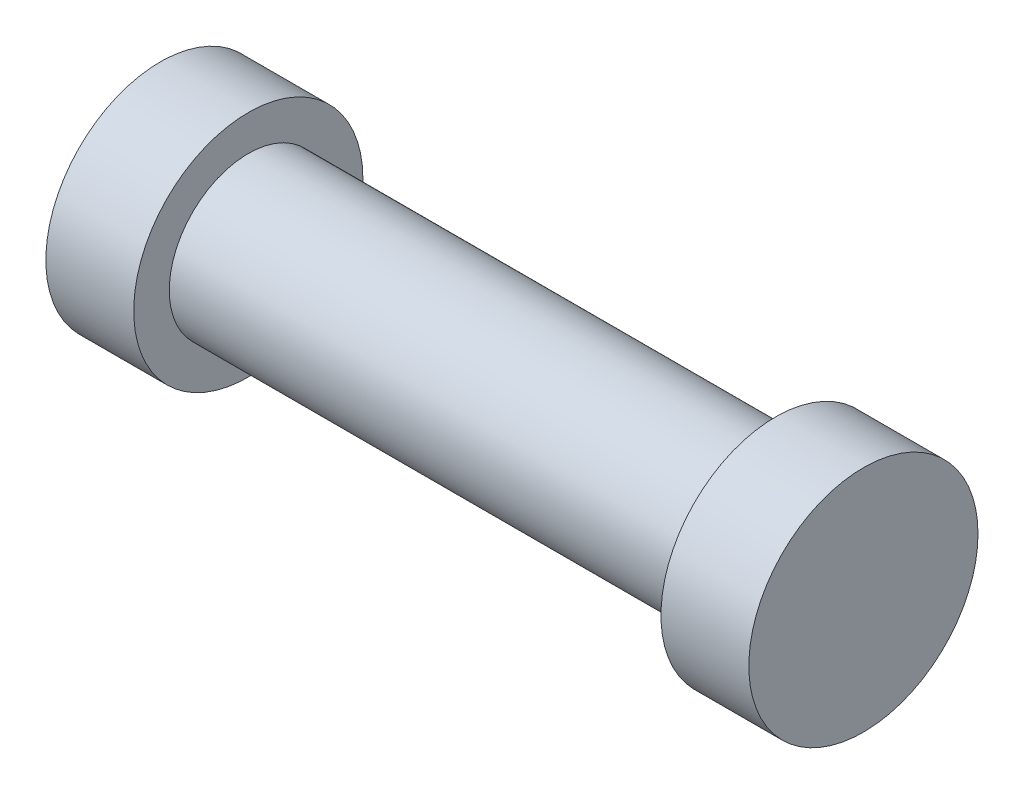
ISO-10303-21;
HEADER;
FILE_DESCRIPTION(('STEP AP214'),'2;1');
FILE_NAME('part.step','',(''),(''),'','','');
FILE_SCHEMA(('AUTOMOTIVE_DESIGN { 1 0 10303 214 1 1 1 1 }'));
ENDSEC;
DATA;
#1=APPLICATION_CONTEXT('core data for automotive mechanical design processes');
#2=APPLICATION_PROTOCOL_DEFINITION('international standard','automotive_design',2000,#1);
#3=PRODUCT_CONTEXT('',#1,'mechanical');
#4=PRODUCT('Part','Part','',(#3));
#5=PRODUCT_RELATED_PRODUCT_CATEGORY('part','',(#4));
#6=PRODUCT_DEFINITION_FORMATION('','',#4);
#7=PRODUCT_DEFINITION_CONTEXT('part definition',#1,'design');
#8=PRODUCT_DEFINITION('design','',#6,#7);
#9=PRODUCT_DEFINITION_SHAPE('','',#8);
#10=(LENGTH_UNIT() NAMED_UNIT(*) SI_UNIT(.MILLI.,.METRE.));
#11=(NAMED_UNIT(*) PLANE_ANGLE_UNIT() SI_UNIT($,.RADIAN.));
#12=(NAMED_UNIT(*) SI_UNIT($,.STERADIAN.) SOLID_ANGLE_UNIT());
#13=UNCERTAINTY_MEASURE_WITH_UNIT(LENGTH_MEASURE(1.E-05),#10,'distance_accuracy_value','');
#14=(GEOMETRIC_REPRESENTATION_CONTEXT(3) GLOBAL_UNCERTAINTY_ASSIGNED_CONTEXT((#13)) GLOBAL_UNIT_ASSIGNED_CONTEXT((#10,
#11,#12)) REPRESENTATION_CONTEXT('',''));
#15=CARTESIAN_POINT('',(0.,0.,0.));
#16=DIRECTION('',(0.,0.,1.));
#17=DIRECTION('',(1.,0.,0.));
#18=AXIS2_PLACEMENT_3D('',#15,#16,#17);
#19=CARTESIAN_POINT('',(3.,0.,0.));
#20=DIRECTION('',(-1.,0.,0.));
#21=DIRECTION('',(0.,0.,1.));
#22=AXIS2_PLACEMENT_3D('',#19,#20,#21);
#23=CYLINDRICAL_SURFACE('',#22,0.9);
#24=CARTESIAN_POINT('',(3.,0.,0.));
#25=DIRECTION('',(1.,0.,0.));
#26=DIRECTION('',(0.,0.,-1.));
#27=AXIS2_PLACEMENT_3D('',#24,#25,#26);
#28=CIRCLE('',#27,0.9);
#29=CARTESIAN_POINT('',(3.,0.,-0.9));
#30=VERTEX_POINT('',#29);
#31=EDGE_CURVE('E10',#30,#30,#28,.T.);
#32=ORIENTED_EDGE('',*,*,#31,.F.);
#33=EDGE_LOOP('',(#32));
#34=FACE_BOUND('',#33,.T.);
#35=CARTESIAN_POINT('',(-3.,0.,0.));
#36=DIRECTION('',(1.,0.,0.));
#37=DIRECTION('',(0.,0.,-1.));
#38=AXIS2_PLACEMENT_3D('',#35,#36,#37);
#39=CIRCLE('',#38,0.9);
#40=CARTESIAN_POINT('',(-3.,0.,-0.9));
#41=VERTEX_POINT('',#40);
#42=EDGE_CURVE('E40',#41,#41,#39,.T.);
#43=ORIENTED_EDGE('',*,*,#42,.T.);
#44=EDGE_LOOP('',(#43));
#45=FACE_BOUND('',#44,.T.);
#46=ADVANCED_FACE('F37',(#34,#45),#23,.T.);
#47=CARTESIAN_POINT('',(4.,0.,0.));
#48=DIRECTION('',(-1.,0.,0.));
#49=DIRECTION('',(0.,0.,1.));
#50=AXIS2_PLACEMENT_3D('',#47,#48,#49);
#51=CYLINDRICAL_SURFACE('',#50,1.30401052070375);
#52=CARTESIAN_POINT('',(4.,0.,0.));
#53=DIRECTION('',(1.,0.,0.));
#54=DIRECTION('',(0.,0.,-1.));
#55=AXIS2_PLACEMENT_3D('',#52,#53,#54);
#56=CIRCLE('',#55,1.30401052070375);
#57=CARTESIAN_POINT('',(4.,0.,-1.30401052070375));
#58=VERTEX_POINT('',#57);
#59=EDGE_CURVE('E45',#58,#58,#56,.T.);
#60=ORIENTED_EDGE('',*,*,#59,.F.);
#61=EDGE_LOOP('',(#60));
#62=FACE_BOUND('',#61,.T.);
#63=CARTESIAN_POINT('',(3.,0.,0.));
#64=DIRECTION('',(1.,0.,0.));
#65=DIRECTION('',(0.,0.,-1.));
#66=AXIS2_PLACEMENT_3D('',#63,#64,#65);
#67=CIRCLE('',#66,1.30401052070375);
#68=CARTESIAN_POINT('',(3.,0.,-1.30401052070375));
#69=VERTEX_POINT('',#68);
#70=EDGE_CURVE('E50',#69,#69,#67,.T.);
#71=ORIENTED_EDGE('',*,*,#70,.T.);
#72=EDGE_LOOP('',(#71));
#73=FACE_BOUND('',#72,.T.);
#74=ADVANCED_FACE('F91',(#62,#73),#51,.T.);
#75=CARTESIAN_POINT('',(4.,0.,0.));
#76=DIRECTION('',(1.,0.,0.));
#77=DIRECTION('',(0.,0.,-1.));
#78=AXIS2_PLACEMENT_3D('',#75,#76,#77);
#79=PLANE('',#78);
#80=ORIENTED_EDGE('',*,*,#59,.T.);
#81=EDGE_LOOP('',(#80));
#82=FACE_BOUND('',#81,.T.);
#83=ADVANCED_FACE('F87',(#82),#79,.T.);
#84=CARTESIAN_POINT('',(3.,0.,0.));
#85=DIRECTION('',(1.,0.,0.));
#86=DIRECTION('',(0.,0.,-1.));
#87=AXIS2_PLACEMENT_3D('',#84,#85,#86);
#88=PLANE('',#87);
#89=ORIENTED_EDGE('',*,*,#31,.T.);
#90=EDGE_LOOP('',(#89));
#91=FACE_BOUND('',#90,.T.);
#92=ORIENTED_EDGE('',*,*,#70,.F.);
#93=EDGE_LOOP('',(#92));
#94=FACE_BOUND('',#93,.T.);
#95=ADVANCED_FACE('F79',(#91,#94),#88,.F.);
#96=CARTESIAN_POINT('',(-4.,0.,0.));
#97=DIRECTION('',(1.,0.,0.));
#98=DIRECTION('',(0.,0.,-1.));
#99=AXIS2_PLACEMENT_3D('',#96,#97,#98);
#100=CYLINDRICAL_SURFACE('',#99,1.30401052070375);
#101=CARTESIAN_POINT('',(-4.,0.,0.));
#102=DIRECTION('',(1.,0.,0.));
#103=DIRECTION('',(0.,0.,-1.));
#104=AXIS2_PLACEMENT_3D('',#101,#102,#103);
#105=CIRCLE('',#104,1.30401052070375);
#106=CARTESIAN_POINT('',(-4.,0.,-1.30401052070375));
#107=VERTEX_POINT('',#106);
#108=EDGE_CURVE('E60',#107,#107,#105,.T.);
#109=ORIENTED_EDGE('',*,*,#108,.T.);
#110=EDGE_LOOP('',(#109));
#111=FACE_BOUND('',#110,.T.);
#112=CARTESIAN_POINT('',(-3.,0.,0.));
#113=DIRECTION('',(1.,0.,0.));
#114=DIRECTION('',(0.,0.,-1.));
#115=AXIS2_PLACEMENT_3D('',#112,#113,#114);
#116=CIRCLE('',#115,1.30401052070375);
#117=CARTESIAN_POINT('',(-3.,0.,-1.30401052070375));
#118=VERTEX_POINT('',#117);
#119=EDGE_CURVE('E56',#118,#118,#116,.T.);
#120=ORIENTED_EDGE('',*,*,#119,.F.);
#121=EDGE_LOOP('',(#120));
#122=FACE_BOUND('',#121,.T.);
#123=ADVANCED_FACE('F77',(#111,#122),#100,.T.);
#124=CARTESIAN_POINT('',(-4.,0.,0.));
#125=DIRECTION('',(-1.,0.,0.));
#126=DIRECTION('',(0.,0.,-1.));
#127=AXIS2_PLACEMENT_3D('',#124,#125,#126);
#128=PLANE('',#127);
#129=ORIENTED_EDGE('',*,*,#108,.F.);
#130=EDGE_LOOP('',(#129));
#131=FACE_BOUND('',#130,.T.);
#132=ADVANCED_FACE('F73',(#131),#128,.T.);
#133=CARTESIAN_POINT('',(-3.,0.,0.));
#134=DIRECTION('',(-1.,0.,0.));
#135=DIRECTION('',(0.,0.,-1.));
#136=AXIS2_PLACEMENT_3D('',#133,#134,#135);
#137=PLANE('',#136);
#138=ORIENTED_EDGE('',*,*,#42,.F.);
#139=EDGE_LOOP('',(#138));
#140=FACE_BOUND('',#139,.T.);
#141=ORIENTED_EDGE('',*,*,#119,.T.);
#142=EDGE_LOOP('',(#141));
#143=FACE_BOUND('',#142,.T.);
#144=ADVANCED_FACE('F70',(#140,#143),#137,.F.);
#145=CLOSED_SHELL('',(#46,#74,#83,#95,#123,#132,#144));
#146=MANIFOLD_SOLID_BREP('B2',#145);
#147=ADVANCED_BREP_SHAPE_REPRESENTATION('',(#18,#146),#14);
#148=SHAPE_DEFINITION_REPRESENTATION(#9,#147);
ENDSEC;
END-ISO-10303-21;
